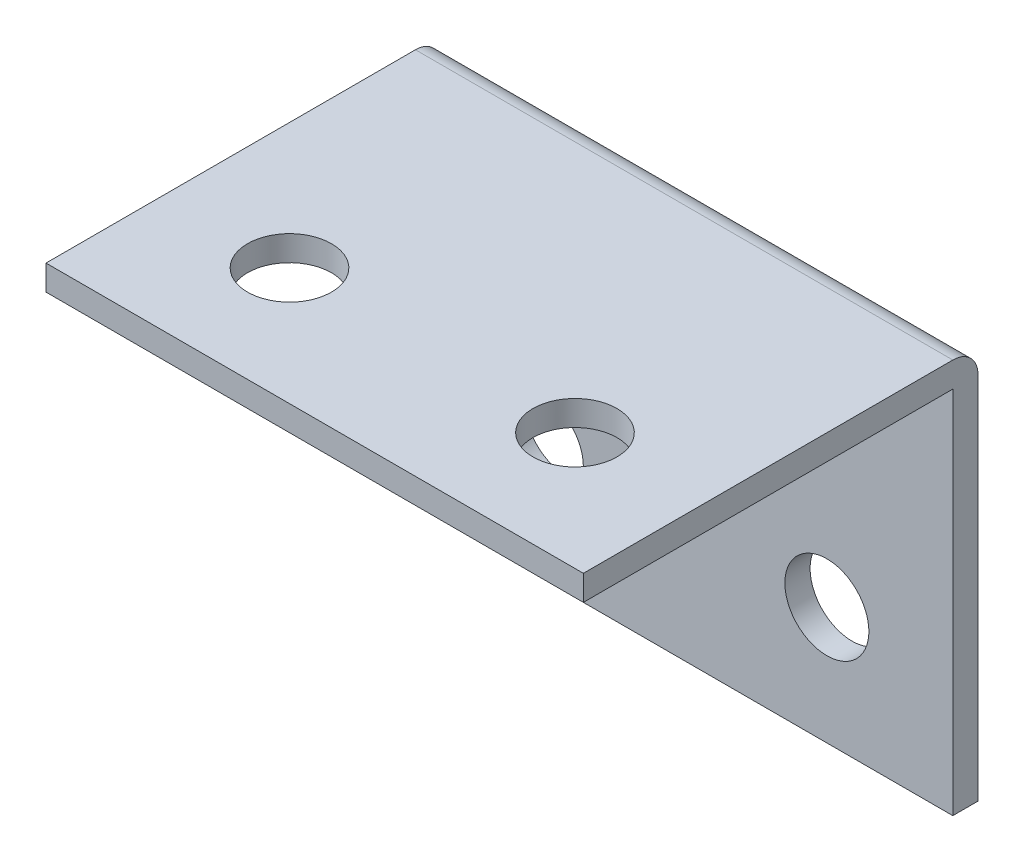
ISO-10303-21;
HEADER;
FILE_DESCRIPTION(('STEP AP214'),'2;1');
FILE_NAME('part.step','',(''),(''),'','','');
FILE_SCHEMA(('AUTOMOTIVE_DESIGN { 1 0 10303 214 1 1 1 1 }'));
ENDSEC;
DATA;
#1=APPLICATION_CONTEXT('core data for automotive mechanical design processes');
#2=APPLICATION_PROTOCOL_DEFINITION('international standard','automotive_design',2000,#1);
#3=PRODUCT_CONTEXT('',#1,'mechanical');
#4=PRODUCT('Part','Part','',(#3));
#5=PRODUCT_RELATED_PRODUCT_CATEGORY('part','',(#4));
#6=PRODUCT_DEFINITION_FORMATION('','',#4);
#7=PRODUCT_DEFINITION_CONTEXT('part definition',#1,'design');
#8=PRODUCT_DEFINITION('design','',#6,#7);
#9=PRODUCT_DEFINITION_SHAPE('','',#8);
#10=(LENGTH_UNIT() NAMED_UNIT(*) SI_UNIT(.MILLI.,.METRE.));
#11=(NAMED_UNIT(*) PLANE_ANGLE_UNIT() SI_UNIT($,.RADIAN.));
#12=(NAMED_UNIT(*) SI_UNIT($,.STERADIAN.) SOLID_ANGLE_UNIT());
#13=UNCERTAINTY_MEASURE_WITH_UNIT(LENGTH_MEASURE(1.E-05),#10,'distance_accuracy_value','');
#14=(GEOMETRIC_REPRESENTATION_CONTEXT(3) GLOBAL_UNCERTAINTY_ASSIGNED_CONTEXT((#13)) GLOBAL_UNIT_ASSIGNED_CONTEXT((#10,
#11,#12)) REPRESENTATION_CONTEXT('',''));
#15=CARTESIAN_POINT('',(0.,0.,0.));
#16=DIRECTION('',(0.,0.,1.));
#17=DIRECTION('',(1.,0.,0.));
#18=AXIS2_PLACEMENT_3D('',#15,#16,#17);
#19=CARTESIAN_POINT('',(0.,23.5,23.5));
#20=DIRECTION('',(0.,-1.,0.));
#21=DIRECTION('',(0.,0.,-1.));
#22=AXIS2_PLACEMENT_3D('',#19,#20,#21);
#23=PLANE('',#22);
#24=DIRECTION('',(0.,0.,-1.));
#25=VECTOR('',#24,1.);
#26=CARTESIAN_POINT('',(32.,23.5,23.5));
#27=LINE('',#26,#25);
#28=CARTESIAN_POINT('',(32.,23.5,23.5));
#29=VERTEX_POINT('',#28);
#30=CARTESIAN_POINT('',(32.,23.5,1.5));
#31=VERTEX_POINT('',#30);
#32=EDGE_CURVE('E144',#29,#31,#27,.T.);
#33=ORIENTED_EDGE('',*,*,#32,.T.);
#34=DIRECTION('',(-1.,0.,0.));
#35=VECTOR('',#34,1.);
#36=CARTESIAN_POINT('',(0.,23.5,1.5));
#37=LINE('',#36,#35);
#38=CARTESIAN_POINT('',(0.,23.5,1.5));
#39=VERTEX_POINT('',#38);
#40=EDGE_CURVE('E150',#31,#39,#37,.T.);
#41=ORIENTED_EDGE('',*,*,#40,.T.);
#42=DIRECTION('',(0.,0.,-1.));
#43=VECTOR('',#42,1.);
#44=CARTESIAN_POINT('',(0.,23.5,23.5));
#45=LINE('',#44,#43);
#46=CARTESIAN_POINT('',(0.,23.5,23.5));
#47=VERTEX_POINT('',#46);
#48=EDGE_CURVE('E136',#47,#39,#45,.T.);
#49=ORIENTED_EDGE('',*,*,#48,.F.);
#50=DIRECTION('',(-1.,0.,0.));
#51=VECTOR('',#50,1.);
#52=CARTESIAN_POINT('',(0.,23.5,23.5));
#53=LINE('',#52,#51);
#54=EDGE_CURVE('E134',#29,#47,#53,.T.);
#55=ORIENTED_EDGE('',*,*,#54,.F.);
#56=EDGE_LOOP('',(#33,#41,#49,#55));
#57=FACE_BOUND('',#56,.T.);
#58=CARTESIAN_POINT('',(24.5,23.5,16.5));
#59=DIRECTION('',(0.,-1.,0.));
#60=DIRECTION('',(0.,0.,-1.));
#61=AXIS2_PLACEMENT_3D('',#58,#59,#60);
#62=CIRCLE('',#61,2.5);
#63=CARTESIAN_POINT('',(24.5,23.5,14.));
#64=VERTEX_POINT('',#63);
#65=EDGE_CURVE('E198',#64,#64,#62,.F.);
#66=ORIENTED_EDGE('',*,*,#65,.F.);
#67=EDGE_LOOP('',(#66));
#68=FACE_BOUND('',#67,.T.);
#69=CARTESIAN_POINT('',(7.5,23.5,16.5));
#70=DIRECTION('',(0.,-1.,0.));
#71=DIRECTION('',(0.,0.,-1.));
#72=AXIS2_PLACEMENT_3D('',#69,#70,#71);
#73=CIRCLE('',#72,2.5);
#74=CARTESIAN_POINT('',(7.5,23.5,14.));
#75=VERTEX_POINT('',#74);
#76=EDGE_CURVE('E193',#75,#75,#73,.T.);
#77=ORIENTED_EDGE('',*,*,#76,.T.);
#78=EDGE_LOOP('',(#77));
#79=FACE_BOUND('',#78,.T.);
#80=ADVANCED_FACE('F36',(#57,#68,#79),#23,.F.);
#81=CARTESIAN_POINT('',(0.,22.,23.5));
#82=DIRECTION('',(0.,-1.,0.));
#83=DIRECTION('',(0.,0.,-1.));
#84=AXIS2_PLACEMENT_3D('',#81,#82,#83);
#85=PLANE('',#84);
#86=CARTESIAN_POINT('',(24.5,22.,16.5));
#87=DIRECTION('',(0.,1.,0.));
#88=DIRECTION('',(0.,0.,1.));
#89=AXIS2_PLACEMENT_3D('',#86,#87,#88);
#90=CIRCLE('',#89,2.5);
#91=CARTESIAN_POINT('',(24.5,22.,19.));
#92=VERTEX_POINT('',#91);
#93=EDGE_CURVE('E202',#92,#92,#90,.T.);
#94=ORIENTED_EDGE('',*,*,#93,.T.);
#95=EDGE_LOOP('',(#94));
#96=FACE_BOUND('',#95,.T.);
#97=DIRECTION('',(-1.,0.,0.));
#98=VECTOR('',#97,1.);
#99=CARTESIAN_POINT('',(0.,22.,1.5));
#100=LINE('',#99,#98);
#101=CARTESIAN_POINT('',(32.,22.,1.5));
#102=VERTEX_POINT('',#101);
#103=CARTESIAN_POINT('',(0.,22.,1.5));
#104=VERTEX_POINT('',#103);
#105=EDGE_CURVE('E91',#102,#104,#100,.T.);
#106=ORIENTED_EDGE('',*,*,#105,.F.);
#107=DIRECTION('',(0.,0.,-1.));
#108=VECTOR('',#107,1.);
#109=CARTESIAN_POINT('',(32.,22.,23.5));
#110=LINE('',#109,#108);
#111=CARTESIAN_POINT('',(32.,22.,23.5));
#112=VERTEX_POINT('',#111);
#113=EDGE_CURVE('E111',#112,#102,#110,.T.);
#114=ORIENTED_EDGE('',*,*,#113,.F.);
#115=DIRECTION('',(-1.,0.,0.));
#116=VECTOR('',#115,1.);
#117=CARTESIAN_POINT('',(0.,22.,23.5));
#118=LINE('',#117,#116);
#119=CARTESIAN_POINT('',(0.,22.,23.5));
#120=VERTEX_POINT('',#119);
#121=EDGE_CURVE('E102',#112,#120,#118,.T.);
#122=ORIENTED_EDGE('',*,*,#121,.T.);
#123=DIRECTION('',(0.,0.,-1.));
#124=VECTOR('',#123,1.);
#125=CARTESIAN_POINT('',(0.,22.,23.5));
#126=LINE('',#125,#124);
#127=EDGE_CURVE('E105',#120,#104,#126,.T.);
#128=ORIENTED_EDGE('',*,*,#127,.T.);
#129=EDGE_LOOP('',(#106,#114,#122,#128));
#130=FACE_BOUND('',#129,.T.);
#131=CARTESIAN_POINT('',(7.5,22.,16.5));
#132=DIRECTION('',(0.,-1.,0.));
#133=DIRECTION('',(0.,0.,-1.));
#134=AXIS2_PLACEMENT_3D('',#131,#132,#133);
#135=CIRCLE('',#134,2.5);
#136=CARTESIAN_POINT('',(7.5,22.,14.));
#137=VERTEX_POINT('',#136);
#138=EDGE_CURVE('E201',#137,#137,#135,.T.);
#139=ORIENTED_EDGE('',*,*,#138,.F.);
#140=EDGE_LOOP('',(#139));
#141=FACE_BOUND('',#140,.T.);
#142=ADVANCED_FACE('F106',(#96,#130,#141),#85,.T.);
#143=CARTESIAN_POINT('',(0.,0.,0.));
#144=DIRECTION('',(0.,0.,-1.));
#145=DIRECTION('',(-1.,0.,0.));
#146=AXIS2_PLACEMENT_3D('',#143,#144,#145);
#147=PLANE('',#146);
#148=CARTESIAN_POINT('',(24.5,7.,0.));
#149=DIRECTION('',(0.,0.,-1.));
#150=DIRECTION('',(-1.,0.,0.));
#151=AXIS2_PLACEMENT_3D('',#148,#149,#150);
#152=CIRCLE('',#151,2.5);
#153=CARTESIAN_POINT('',(22.,7.,0.));
#154=VERTEX_POINT('',#153);
#155=EDGE_CURVE('E122',#154,#154,#152,.F.);
#156=ORIENTED_EDGE('',*,*,#155,.T.);
#157=EDGE_LOOP('',(#156));
#158=FACE_BOUND('',#157,.T.);
#159=DIRECTION('',(0.,-1.,0.));
#160=VECTOR('',#159,1.);
#161=CARTESIAN_POINT('',(0.,0.,0.));
#162=LINE('',#161,#160);
#163=CARTESIAN_POINT('',(0.,22.,0.));
#164=VERTEX_POINT('',#163);
#165=CARTESIAN_POINT('',(0.,0.,0.));
#166=VERTEX_POINT('',#165);
#167=EDGE_CURVE('E127',#164,#166,#162,.T.);
#168=ORIENTED_EDGE('',*,*,#167,.F.);
#169=DIRECTION('',(-1.,0.,0.));
#170=VECTOR('',#169,1.);
#171=CARTESIAN_POINT('',(0.,22.,0.));
#172=LINE('',#171,#170);
#173=CARTESIAN_POINT('',(32.,22.,0.));
#174=VERTEX_POINT('',#173);
#175=EDGE_CURVE('E153',#164,#174,#172,.F.);
#176=ORIENTED_EDGE('',*,*,#175,.T.);
#177=DIRECTION('',(0.,1.,0.));
#178=VECTOR('',#177,1.);
#179=CARTESIAN_POINT('',(32.,0.,0.));
#180=LINE('',#179,#178);
#181=CARTESIAN_POINT('',(32.,0.,0.));
#182=VERTEX_POINT('',#181);
#183=EDGE_CURVE('E132',#182,#174,#180,.T.);
#184=ORIENTED_EDGE('',*,*,#183,.F.);
#185=DIRECTION('',(1.,0.,0.));
#186=VECTOR('',#185,1.);
#187=CARTESIAN_POINT('',(0.,0.,0.));
#188=LINE('',#187,#186);
#189=EDGE_CURVE('E138',#166,#182,#188,.T.);
#190=ORIENTED_EDGE('',*,*,#189,.F.);
#191=EDGE_LOOP('',(#168,#176,#184,#190));
#192=FACE_BOUND('',#191,.T.);
#193=CARTESIAN_POINT('',(7.5,7.,0.));
#194=DIRECTION('',(0.,0.,-1.));
#195=DIRECTION('',(-1.,0.,0.));
#196=AXIS2_PLACEMENT_3D('',#193,#194,#195);
#197=CIRCLE('',#196,2.5);
#198=CARTESIAN_POINT('',(5.,7.,0.));
#199=VERTEX_POINT('',#198);
#200=EDGE_CURVE('E118',#199,#199,#197,.T.);
#201=ORIENTED_EDGE('',*,*,#200,.F.);
#202=EDGE_LOOP('',(#201));
#203=FACE_BOUND('',#202,.T.);
#204=ADVANCED_FACE('F171',(#158,#192,#203),#147,.T.);
#205=CARTESIAN_POINT('',(0.,0.,1.5));
#206=DIRECTION('',(0.,0.,-1.));
#207=DIRECTION('',(-1.,0.,0.));
#208=AXIS2_PLACEMENT_3D('',#205,#206,#207);
#209=PLANE('',#208);
#210=DIRECTION('',(0.,-1.,0.));
#211=VECTOR('',#210,1.);
#212=CARTESIAN_POINT('',(0.,0.,1.5));
#213=LINE('',#212,#211);
#214=CARTESIAN_POINT('',(0.,0.,1.5));
#215=VERTEX_POINT('',#214);
#216=EDGE_CURVE('E96',#104,#215,#213,.T.);
#217=ORIENTED_EDGE('',*,*,#216,.T.);
#218=DIRECTION('',(1.,0.,0.));
#219=VECTOR('',#218,1.);
#220=CARTESIAN_POINT('',(0.,0.,1.5));
#221=LINE('',#220,#219);
#222=CARTESIAN_POINT('',(32.,0.,1.5));
#223=VERTEX_POINT('',#222);
#224=EDGE_CURVE('E117',#215,#223,#221,.T.);
#225=ORIENTED_EDGE('',*,*,#224,.T.);
#226=DIRECTION('',(0.,1.,0.));
#227=VECTOR('',#226,1.);
#228=CARTESIAN_POINT('',(32.,0.,1.5));
#229=LINE('',#228,#227);
#230=EDGE_CURVE('E99',#223,#102,#229,.T.);
#231=ORIENTED_EDGE('',*,*,#230,.T.);
#232=ORIENTED_EDGE('',*,*,#105,.T.);
#233=EDGE_LOOP('',(#217,#225,#231,#232));
#234=FACE_BOUND('',#233,.T.);
#235=CARTESIAN_POINT('',(24.5,7.,1.5));
#236=DIRECTION('',(0.,0.,-1.));
#237=DIRECTION('',(-1.,0.,0.));
#238=AXIS2_PLACEMENT_3D('',#235,#236,#237);
#239=CIRCLE('',#238,2.5);
#240=CARTESIAN_POINT('',(22.,7.,1.5));
#241=VERTEX_POINT('',#240);
#242=EDGE_CURVE('E188',#241,#241,#239,.T.);
#243=ORIENTED_EDGE('',*,*,#242,.T.);
#244=EDGE_LOOP('',(#243));
#245=FACE_BOUND('',#244,.T.);
#246=CARTESIAN_POINT('',(7.5,7.,1.5));
#247=DIRECTION('',(0.,0.,1.));
#248=DIRECTION('',(1.,0.,0.));
#249=AXIS2_PLACEMENT_3D('',#246,#247,#248);
#250=CIRCLE('',#249,2.5);
#251=CARTESIAN_POINT('',(10.,7.,1.5));
#252=VERTEX_POINT('',#251);
#253=EDGE_CURVE('E186',#252,#252,#250,.T.);
#254=ORIENTED_EDGE('',*,*,#253,.F.);
#255=EDGE_LOOP('',(#254));
#256=FACE_BOUND('',#255,.T.);
#257=ADVANCED_FACE('F93',(#234,#245,#256),#209,.F.);
#258=CARTESIAN_POINT('',(0.,22.,1.5));
#259=DIRECTION('',(1.,0.,0.));
#260=DIRECTION('',(0.,0.,-1.));
#261=AXIS2_PLACEMENT_3D('',#258,#259,#260);
#262=CYLINDRICAL_SURFACE('',#261,1.5);
#263=ORIENTED_EDGE('',*,*,#40,.F.);
#264=CARTESIAN_POINT('',(32.,22.,1.5));
#265=DIRECTION('',(-1.,0.,0.));
#266=DIRECTION('',(0.,0.,1.));
#267=AXIS2_PLACEMENT_3D('',#264,#265,#266);
#268=CIRCLE('',#267,1.5);
#269=EDGE_CURVE('E44',#174,#31,#268,.F.);
#270=ORIENTED_EDGE('',*,*,#269,.F.);
#271=ORIENTED_EDGE('',*,*,#175,.F.);
#272=CARTESIAN_POINT('',(0.,22.,1.5));
#273=DIRECTION('',(1.,0.,0.));
#274=DIRECTION('',(0.,0.,-1.));
#275=AXIS2_PLACEMENT_3D('',#272,#273,#274);
#276=CIRCLE('',#275,1.5);
#277=EDGE_CURVE('E11',#39,#164,#276,.F.);
#278=ORIENTED_EDGE('',*,*,#277,.F.);
#279=EDGE_LOOP('',(#263,#270,#271,#278));
#280=FACE_BOUND('',#279,.T.);
#281=ADVANCED_FACE('F38',(#280),#262,.T.);
#282=CARTESIAN_POINT('',(0.,0.,23.5));
#283=DIRECTION('',(1.,0.,0.));
#284=DIRECTION('',(0.,0.,-1.));
#285=AXIS2_PLACEMENT_3D('',#282,#283,#284);
#286=PLANE('',#285);
#287=ORIENTED_EDGE('',*,*,#48,.T.);
#288=ORIENTED_EDGE('',*,*,#277,.T.);
#289=ORIENTED_EDGE('',*,*,#167,.T.);
#290=DIRECTION('',(0.,0.,-1.));
#291=VECTOR('',#290,1.);
#292=CARTESIAN_POINT('',(0.,0.,23.5));
#293=LINE('',#292,#291);
#294=EDGE_CURVE('E116',#215,#166,#293,.T.);
#295=ORIENTED_EDGE('',*,*,#294,.F.);
#296=ORIENTED_EDGE('',*,*,#216,.F.);
#297=ORIENTED_EDGE('',*,*,#127,.F.);
#298=DIRECTION('',(0.,-1.,0.));
#299=VECTOR('',#298,1.);
#300=CARTESIAN_POINT('',(0.,0.,23.5));
#301=LINE('',#300,#299);
#302=EDGE_CURVE('E129',#47,#120,#301,.T.);
#303=ORIENTED_EDGE('',*,*,#302,.F.);
#304=EDGE_LOOP('',(#287,#288,#289,#295,#296,#297,#303));
#305=FACE_BOUND('',#304,.T.);
#306=ADVANCED_FACE('F114',(#305),#286,.F.);
#307=CARTESIAN_POINT('',(0.,0.,23.5));
#308=DIRECTION('',(0.,1.,0.));
#309=DIRECTION('',(0.,0.,1.));
#310=AXIS2_PLACEMENT_3D('',#307,#308,#309);
#311=PLANE('',#310);
#312=ORIENTED_EDGE('',*,*,#224,.F.);
#313=ORIENTED_EDGE('',*,*,#294,.T.);
#314=ORIENTED_EDGE('',*,*,#189,.T.);
#315=DIRECTION('',(0.,0.,-1.));
#316=VECTOR('',#315,1.);
#317=CARTESIAN_POINT('',(32.,0.,23.5));
#318=LINE('',#317,#316);
#319=EDGE_CURVE('E147',#223,#182,#318,.T.);
#320=ORIENTED_EDGE('',*,*,#319,.F.);
#321=EDGE_LOOP('',(#312,#313,#314,#320));
#322=FACE_BOUND('',#321,.T.);
#323=ADVANCED_FACE('F167',(#322),#311,.F.);
#324=CARTESIAN_POINT('',(32.,0.,23.5));
#325=DIRECTION('',(-1.,0.,0.));
#326=DIRECTION('',(0.,0.,1.));
#327=AXIS2_PLACEMENT_3D('',#324,#325,#326);
#328=PLANE('',#327);
#329=ORIENTED_EDGE('',*,*,#183,.T.);
#330=ORIENTED_EDGE('',*,*,#269,.T.);
#331=ORIENTED_EDGE('',*,*,#32,.F.);
#332=DIRECTION('',(0.,1.,0.));
#333=VECTOR('',#332,1.);
#334=CARTESIAN_POINT('',(32.,0.,23.5));
#335=LINE('',#334,#333);
#336=EDGE_CURVE('E131',#112,#29,#335,.T.);
#337=ORIENTED_EDGE('',*,*,#336,.F.);
#338=ORIENTED_EDGE('',*,*,#113,.T.);
#339=ORIENTED_EDGE('',*,*,#230,.F.);
#340=ORIENTED_EDGE('',*,*,#319,.T.);
#341=EDGE_LOOP('',(#329,#330,#331,#337,#338,#339,#340));
#342=FACE_BOUND('',#341,.T.);
#343=ADVANCED_FACE('F156',(#342),#328,.F.);
#344=CARTESIAN_POINT('',(0.,0.,23.5));
#345=DIRECTION('',(0.,0.,-1.));
#346=DIRECTION('',(-1.,0.,0.));
#347=AXIS2_PLACEMENT_3D('',#344,#345,#346);
#348=PLANE('',#347);
#349=ORIENTED_EDGE('',*,*,#121,.F.);
#350=ORIENTED_EDGE('',*,*,#336,.T.);
#351=ORIENTED_EDGE('',*,*,#54,.T.);
#352=ORIENTED_EDGE('',*,*,#302,.T.);
#353=EDGE_LOOP('',(#349,#350,#351,#352));
#354=FACE_BOUND('',#353,.T.);
#355=ADVANCED_FACE('F164',(#354),#348,.F.);
#356=CARTESIAN_POINT('',(24.5,7.,-22.));
#357=DIRECTION('',(0.,0.,1.));
#358=DIRECTION('',(1.,0.,0.));
#359=AXIS2_PLACEMENT_3D('',#356,#357,#358);
#360=CYLINDRICAL_SURFACE('',#359,2.5);
#361=ORIENTED_EDGE('',*,*,#155,.F.);
#362=EDGE_LOOP('',(#361));
#363=FACE_BOUND('',#362,.T.);
#364=ORIENTED_EDGE('',*,*,#242,.F.);
#365=EDGE_LOOP('',(#364));
#366=FACE_BOUND('',#365,.T.);
#367=ADVANCED_FACE('F182',(#363,#366),#360,.F.);
#368=CARTESIAN_POINT('',(7.5,7.,-22.));
#369=DIRECTION('',(0.,0.,1.));
#370=DIRECTION('',(1.,0.,0.));
#371=AXIS2_PLACEMENT_3D('',#368,#369,#370);
#372=CYLINDRICAL_SURFACE('',#371,2.5);
#373=ORIENTED_EDGE('',*,*,#200,.T.);
#374=EDGE_LOOP('',(#373));
#375=FACE_BOUND('',#374,.T.);
#376=ORIENTED_EDGE('',*,*,#253,.T.);
#377=EDGE_LOOP('',(#376));
#378=FACE_BOUND('',#377,.T.);
#379=ADVANCED_FACE('F178',(#375,#378),#372,.F.);
#380=CARTESIAN_POINT('',(24.5,45.5,16.5));
#381=DIRECTION('',(0.,-1.,0.));
#382=DIRECTION('',(0.,0.,-1.));
#383=AXIS2_PLACEMENT_3D('',#380,#381,#382);
#384=CYLINDRICAL_SURFACE('',#383,2.5);
#385=ORIENTED_EDGE('',*,*,#93,.F.);
#386=EDGE_LOOP('',(#385));
#387=FACE_BOUND('',#386,.T.);
#388=ORIENTED_EDGE('',*,*,#65,.T.);
#389=EDGE_LOOP('',(#388));
#390=FACE_BOUND('',#389,.T.);
#391=ADVANCED_FACE('F181',(#387,#390),#384,.F.);
#392=CARTESIAN_POINT('',(7.5,45.5,16.5));
#393=DIRECTION('',(0.,-1.,0.));
#394=DIRECTION('',(0.,0.,-1.));
#395=AXIS2_PLACEMENT_3D('',#392,#393,#394);
#396=CYLINDRICAL_SURFACE('',#395,2.5);
#397=ORIENTED_EDGE('',*,*,#138,.T.);
#398=EDGE_LOOP('',(#397));
#399=FACE_BOUND('',#398,.T.);
#400=ORIENTED_EDGE('',*,*,#76,.F.);
#401=EDGE_LOOP('',(#400));
#402=FACE_BOUND('',#401,.T.);
#403=ADVANCED_FACE('F208',(#399,#402),#396,.F.);
#404=CLOSED_SHELL('',(#80,#142,#204,#257,#281,#306,#323,#343,#355,#367,#379,#391,#403));
#405=MANIFOLD_SOLID_BREP('B2',#404);
#406=ADVANCED_BREP_SHAPE_REPRESENTATION('',(#18,#405),#14);
#407=SHAPE_DEFINITION_REPRESENTATION(#9,#406);
ENDSEC;
END-ISO-10303-21;
